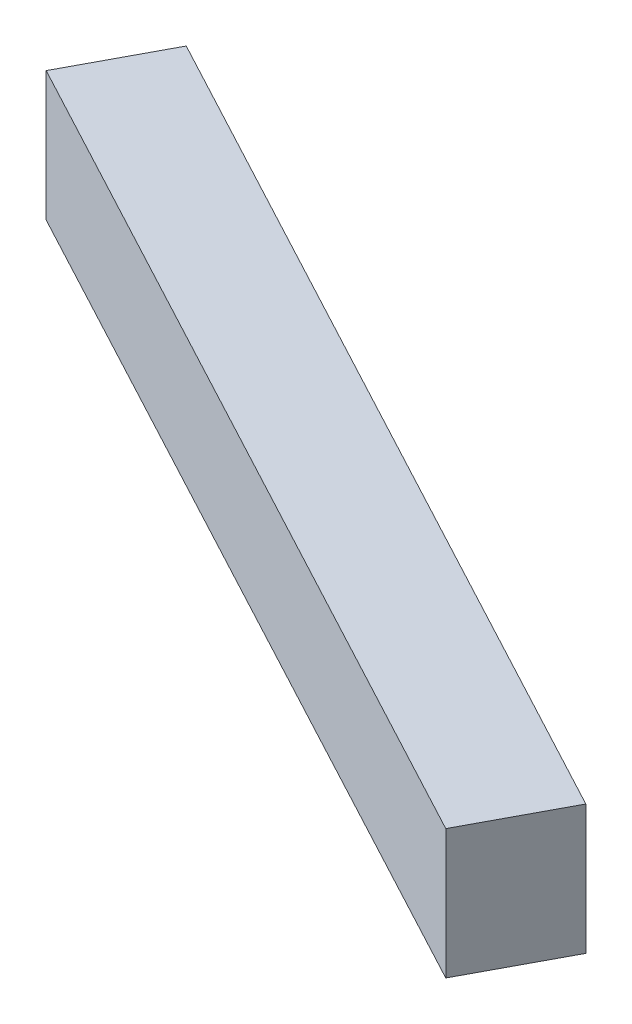
ISO-10303-21;
HEADER;
FILE_DESCRIPTION(('STEP AP214'),'2;1');
FILE_NAME('part.step','',(''),(''),'','','');
FILE_SCHEMA(('AUTOMOTIVE_DESIGN { 1 0 10303 214 1 1 1 1 }'));
ENDSEC;
DATA;
#1=APPLICATION_CONTEXT('core data for automotive mechanical design processes');
#2=APPLICATION_PROTOCOL_DEFINITION('international standard','automotive_design',2000,#1);
#3=PRODUCT_CONTEXT('',#1,'mechanical');
#4=PRODUCT('Part','Part','',(#3));
#5=PRODUCT_RELATED_PRODUCT_CATEGORY('part','',(#4));
#6=PRODUCT_DEFINITION_FORMATION('','',#4);
#7=PRODUCT_DEFINITION_CONTEXT('part definition',#1,'design');
#8=PRODUCT_DEFINITION('design','',#6,#7);
#9=PRODUCT_DEFINITION_SHAPE('','',#8);
#10=(LENGTH_UNIT() NAMED_UNIT(*) SI_UNIT(.MILLI.,.METRE.));
#11=(NAMED_UNIT(*) PLANE_ANGLE_UNIT() SI_UNIT($,.RADIAN.));
#12=(NAMED_UNIT(*) SI_UNIT($,.STERADIAN.) SOLID_ANGLE_UNIT());
#13=UNCERTAINTY_MEASURE_WITH_UNIT(LENGTH_MEASURE(1.E-05),#10,'distance_accuracy_value','');
#14=(GEOMETRIC_REPRESENTATION_CONTEXT(3) GLOBAL_UNCERTAINTY_ASSIGNED_CONTEXT((#13)) GLOBAL_UNIT_ASSIGNED_CONTEXT((#10,
#11,#12)) REPRESENTATION_CONTEXT('',''));
#15=CARTESIAN_POINT('',(0.,0.,0.));
#16=DIRECTION('',(0.,0.,1.));
#17=DIRECTION('',(1.,0.,0.));
#18=AXIS2_PLACEMENT_3D('',#15,#16,#17);
#19=CARTESIAN_POINT('',(15.9282712927121,7.874,8.38057188627171));
#20=DIRECTION('',(-0.470580736480349,0.,0.882356940502885));
#21=DIRECTION('',(0.882356940502885,0.,0.470580736480349));
#22=AXIS2_PLACEMENT_3D('',#19,#20,#21);
#23=PLANE('',#22);
#24=DIRECTION('',(0.,1.,0.));
#25=VECTOR('',#24,1.);
#26=CARTESIAN_POINT('',(15.9282712927121,7.874,8.38057188627171));
#27=LINE('',#26,#25);
#28=CARTESIAN_POINT('',(15.9282712927121,7.62,8.38057188627171));
#29=VERTEX_POINT('',#28);
#30=CARTESIAN_POINT('',(15.9282712927121,7.874,8.38057188627171));
#31=VERTEX_POINT('',#30);
#32=EDGE_CURVE('E20',#29,#31,#27,.T.);
#33=ORIENTED_EDGE('',*,*,#32,.T.);
#34=DIRECTION('',(-0.882356940502885,0.,-0.47058073648035));
#35=VECTOR('',#34,1.);
#36=CARTESIAN_POINT('',(17.6091612643701,7.874,9.27702818926678));
#37=LINE('',#36,#35);
#38=CARTESIAN_POINT('',(17.6091612643701,7.874,9.27702818926678));
#39=VERTEX_POINT('',#38);
#40=EDGE_CURVE('E55',#39,#31,#37,.T.);
#41=ORIENTED_EDGE('',*,*,#40,.F.);
#42=DIRECTION('',(0.,1.,0.));
#43=VECTOR('',#42,1.);
#44=CARTESIAN_POINT('',(17.6091612643701,7.874,9.27702818926678));
#45=LINE('',#44,#43);
#46=CARTESIAN_POINT('',(17.6091612643701,7.62,9.27702818926678));
#47=VERTEX_POINT('',#46);
#48=EDGE_CURVE('E76',#39,#47,#45,.F.);
#49=ORIENTED_EDGE('',*,*,#48,.T.);
#50=DIRECTION('',(-0.882356940502885,0.,-0.47058073648035));
#51=VECTOR('',#50,1.);
#52=CARTESIAN_POINT('',(17.6091612643701,7.62,9.27702818926678));
#53=LINE('',#52,#51);
#54=EDGE_CURVE('E58',#47,#29,#53,.T.);
#55=ORIENTED_EDGE('',*,*,#54,.T.);
#56=EDGE_LOOP('',(#33,#41,#49,#55));
#57=FACE_BOUND('',#56,.T.);
#58=ADVANCED_FACE('F17',(#57),#23,.F.);
#59=CARTESIAN_POINT('',(15.9282712927121,7.874,8.38057188627171));
#60=DIRECTION('',(0.882356940502898,0.,0.470580736480326));
#61=DIRECTION('',(0.470580736480326,0.,-0.882356940502898));
#62=AXIS2_PLACEMENT_3D('',#59,#60,#61);
#63=PLANE('',#62);
#64=DIRECTION('',(0.,1.,0.));
#65=VECTOR('',#64,1.);
#66=CARTESIAN_POINT('',(15.8326492870593,7.874,8.55986681658191));
#67=LINE('',#66,#65);
#68=CARTESIAN_POINT('',(15.8326492870593,7.62,8.55986681658191));
#69=VERTEX_POINT('',#68);
#70=CARTESIAN_POINT('',(15.8326492870593,7.874,8.55986681658191));
#71=VERTEX_POINT('',#70);
#72=EDGE_CURVE('E73',#69,#71,#67,.T.);
#73=ORIENTED_EDGE('',*,*,#72,.T.);
#74=DIRECTION('',(-0.470580736480302,0.,0.88235694050291));
#75=VECTOR('',#74,1.);
#76=CARTESIAN_POINT('',(15.9282712927121,7.874,8.38057188627171));
#77=LINE('',#76,#75);
#78=EDGE_CURVE('E63',#31,#71,#77,.T.);
#79=ORIENTED_EDGE('',*,*,#78,.F.);
#80=ORIENTED_EDGE('',*,*,#32,.F.);
#81=DIRECTION('',(-0.470580736480302,0.,0.88235694050291));
#82=VECTOR('',#81,1.);
#83=CARTESIAN_POINT('',(15.9282712927121,7.62,8.38057188627171));
#84=LINE('',#83,#82);
#85=EDGE_CURVE('E80',#29,#69,#84,.T.);
#86=ORIENTED_EDGE('',*,*,#85,.T.);
#87=EDGE_LOOP('',(#73,#79,#80,#86));
#88=FACE_BOUND('',#87,.T.);
#89=ADVANCED_FACE('F72',(#88),#63,.F.);
#90=CARTESIAN_POINT('',(15.8326492870593,7.874,8.55986681658191));
#91=DIRECTION('',(0.,1.,0.));
#92=DIRECTION('',(0.,0.,1.));
#93=AXIS2_PLACEMENT_3D('',#90,#91,#92);
#94=PLANE('',#93);
#95=DIRECTION('',(-0.470580735137151,0.,0.882356941219243));
#96=VECTOR('',#95,1.);
#97=CARTESIAN_POINT('',(17.6091612643701,7.874,9.27702818926678));
#98=LINE('',#97,#96);
#99=CARTESIAN_POINT('',(17.5135392589902,7.874,9.45632311972253));
#100=VERTEX_POINT('',#99);
#101=EDGE_CURVE('E69',#100,#39,#98,.F.);
#102=ORIENTED_EDGE('',*,*,#101,.T.);
#103=ORIENTED_EDGE('',*,*,#40,.T.);
#104=ORIENTED_EDGE('',*,*,#78,.T.);
#105=DIRECTION('',(-0.882356940502886,0.,-0.470580736480348));
#106=VECTOR('',#105,1.);
#107=CARTESIAN_POINT('',(15.8326492870593,7.874,8.55986681658191));
#108=LINE('',#107,#106);
#109=EDGE_CURVE('E83',#71,#100,#108,.F.);
#110=ORIENTED_EDGE('',*,*,#109,.T.);
#111=EDGE_LOOP('',(#102,#103,#104,#110));
#112=FACE_BOUND('',#111,.T.);
#113=ADVANCED_FACE('F66',(#112),#94,.T.);
#114=CARTESIAN_POINT('',(17.6091612643701,7.874,9.27702818926678));
#115=DIRECTION('',(-0.882356941219243,0.,-0.470580735137151));
#116=DIRECTION('',(-0.470580735137151,0.,0.882356941219243));
#117=AXIS2_PLACEMENT_3D('',#114,#115,#116);
#118=PLANE('',#117);
#119=ORIENTED_EDGE('',*,*,#48,.F.);
#120=ORIENTED_EDGE('',*,*,#101,.F.);
#121=DIRECTION('',(0.,1.,0.));
#122=VECTOR('',#121,1.);
#123=CARTESIAN_POINT('',(17.5135392589902,7.874,9.45632311972252));
#124=LINE('',#123,#122);
#125=CARTESIAN_POINT('',(17.5135392589902,7.62,9.45632311972253));
#126=VERTEX_POINT('',#125);
#127=EDGE_CURVE('E26',#100,#126,#124,.F.);
#128=ORIENTED_EDGE('',*,*,#127,.T.);
#129=DIRECTION('',(0.470580735137274,0.,-0.882356941219177));
#130=VECTOR('',#129,1.);
#131=CARTESIAN_POINT('',(17.5135392589902,7.62,9.45632311972253));
#132=LINE('',#131,#130);
#133=EDGE_CURVE('E34',#126,#47,#132,.T.);
#134=ORIENTED_EDGE('',*,*,#133,.T.);
#135=EDGE_LOOP('',(#119,#120,#128,#134));
#136=FACE_BOUND('',#135,.T.);
#137=ADVANCED_FACE('F88',(#136),#118,.F.);
#138=CARTESIAN_POINT('',(15.8326492870593,7.62,8.55986681658191));
#139=DIRECTION('',(0.,1.,0.));
#140=DIRECTION('',(0.,0.,1.));
#141=AXIS2_PLACEMENT_3D('',#138,#139,#140);
#142=PLANE('',#141);
#143=ORIENTED_EDGE('',*,*,#54,.F.);
#144=ORIENTED_EDGE('',*,*,#133,.F.);
#145=DIRECTION('',(-0.882356940502886,0.,-0.470580736480348));
#146=VECTOR('',#145,1.);
#147=CARTESIAN_POINT('',(15.8326492870593,7.62,8.55986681658191));
#148=LINE('',#147,#146);
#149=EDGE_CURVE('E11',#126,#69,#148,.T.);
#150=ORIENTED_EDGE('',*,*,#149,.T.);
#151=ORIENTED_EDGE('',*,*,#85,.F.);
#152=EDGE_LOOP('',(#143,#144,#150,#151));
#153=FACE_BOUND('',#152,.T.);
#154=ADVANCED_FACE('F91',(#153),#142,.F.);
#155=CARTESIAN_POINT('',(15.8326492870593,7.874,8.55986681658191));
#156=DIRECTION('',(0.470580736480348,0.,-0.882356940502886));
#157=DIRECTION('',(-0.882356940502886,0.,-0.470580736480348));
#158=AXIS2_PLACEMENT_3D('',#155,#156,#157);
#159=PLANE('',#158);
#160=ORIENTED_EDGE('',*,*,#127,.F.);
#161=ORIENTED_EDGE('',*,*,#109,.F.);
#162=ORIENTED_EDGE('',*,*,#72,.F.);
#163=ORIENTED_EDGE('',*,*,#149,.F.);
#164=EDGE_LOOP('',(#160,#161,#162,#163));
#165=FACE_BOUND('',#164,.T.);
#166=ADVANCED_FACE('F90',(#165),#159,.F.);
#167=CLOSED_SHELL('',(#58,#89,#113,#137,#154,#166));
#168=MANIFOLD_SOLID_BREP('B1',#167);
#169=ADVANCED_BREP_SHAPE_REPRESENTATION('',(#18,#168),#14);
#170=SHAPE_DEFINITION_REPRESENTATION(#9,#169);
ENDSEC;
END-ISO-10303-21;
